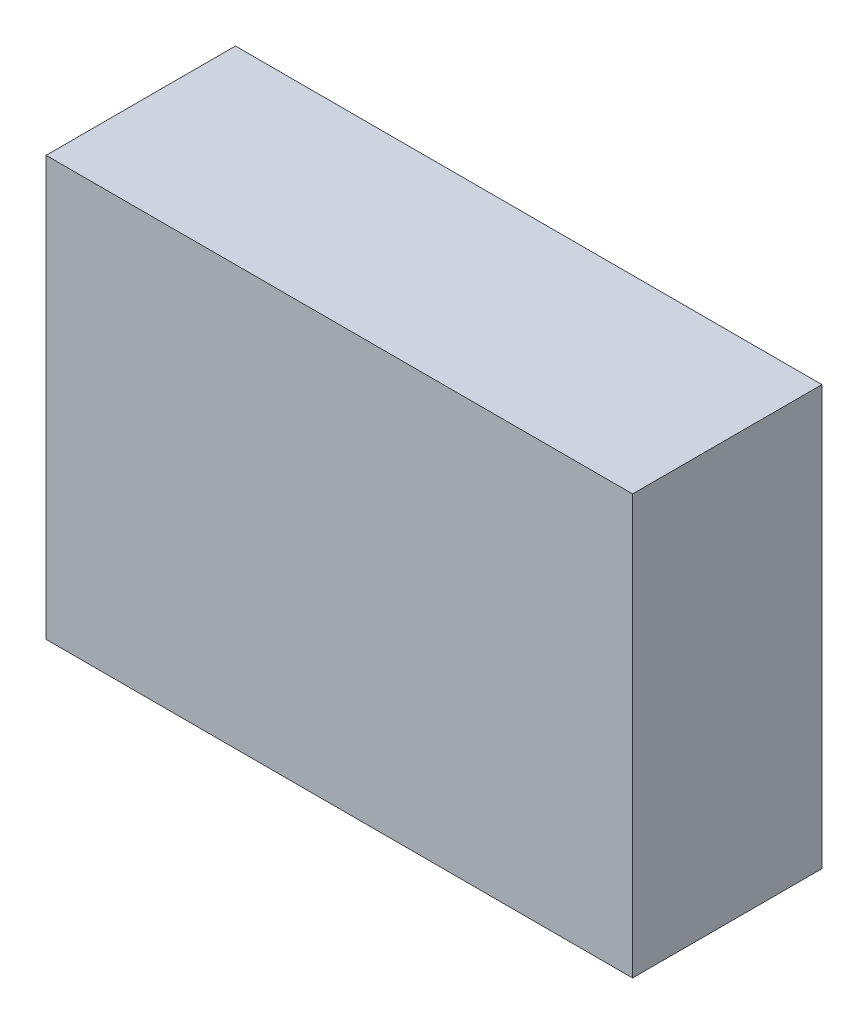
ISO-10303-21;
HEADER;
FILE_DESCRIPTION(('STEP AP214'),'2;1');
FILE_NAME('part.step','',(''),(''),'','','');
FILE_SCHEMA(('AUTOMOTIVE_DESIGN { 1 0 10303 214 1 1 1 1 }'));
ENDSEC;
DATA;
#1=APPLICATION_CONTEXT('core data for automotive mechanical design processes');
#2=APPLICATION_PROTOCOL_DEFINITION('international standard','automotive_design',2000,#1);
#3=PRODUCT_CONTEXT('',#1,'mechanical');
#4=PRODUCT('Part','Part','',(#3));
#5=PRODUCT_RELATED_PRODUCT_CATEGORY('part','',(#4));
#6=PRODUCT_DEFINITION_FORMATION('','',#4);
#7=PRODUCT_DEFINITION_CONTEXT('part definition',#1,'design');
#8=PRODUCT_DEFINITION('design','',#6,#7);
#9=PRODUCT_DEFINITION_SHAPE('','',#8);
#10=(LENGTH_UNIT() NAMED_UNIT(*) SI_UNIT(.MILLI.,.METRE.));
#11=(NAMED_UNIT(*) PLANE_ANGLE_UNIT() SI_UNIT($,.RADIAN.));
#12=(NAMED_UNIT(*) SI_UNIT($,.STERADIAN.) SOLID_ANGLE_UNIT());
#13=UNCERTAINTY_MEASURE_WITH_UNIT(LENGTH_MEASURE(1.E-05),#10,'distance_accuracy_value','');
#14=(GEOMETRIC_REPRESENTATION_CONTEXT(3) GLOBAL_UNCERTAINTY_ASSIGNED_CONTEXT((#13)) GLOBAL_UNIT_ASSIGNED_CONTEXT((#10,
#11,#12)) REPRESENTATION_CONTEXT('',''));
#15=CARTESIAN_POINT('',(0.,0.,0.));
#16=DIRECTION('',(0.,0.,1.));
#17=DIRECTION('',(1.,0.,0.));
#18=AXIS2_PLACEMENT_3D('',#15,#16,#17);
#19=CARTESIAN_POINT('',(0.,0.,0.686));
#20=DIRECTION('',(0.,0.,1.));
#21=DIRECTION('',(1.,0.,0.));
#22=AXIS2_PLACEMENT_3D('',#19,#20,#21);
#23=PLANE('',#22);
#24=DIRECTION('',(0.,1.,0.));
#25=VECTOR('',#24,1.);
#26=CARTESIAN_POINT('',(0.,0.,0.686));
#27=LINE('',#26,#25);
#28=CARTESIAN_POINT('',(0.,0.,0.686));
#29=VERTEX_POINT('',#28);
#30=CARTESIAN_POINT('',(0.,1.519,0.686));
#31=VERTEX_POINT('',#30);
#32=EDGE_CURVE('E81',#29,#31,#27,.T.);
#33=ORIENTED_EDGE('',*,*,#32,.F.);
#34=DIRECTION('',(1.,0.,0.));
#35=VECTOR('',#34,1.);
#36=CARTESIAN_POINT('',(0.,0.,0.686));
#37=LINE('',#36,#35);
#38=CARTESIAN_POINT('',(2.125,0.,0.686));
#39=VERTEX_POINT('',#38);
#40=EDGE_CURVE('E65',#29,#39,#37,.T.);
#41=ORIENTED_EDGE('',*,*,#40,.T.);
#42=DIRECTION('',(0.,1.,0.));
#43=VECTOR('',#42,1.);
#44=CARTESIAN_POINT('',(2.125,0.,0.686));
#45=LINE('',#44,#43);
#46=CARTESIAN_POINT('',(2.125,1.519,0.686));
#47=VERTEX_POINT('',#46);
#48=EDGE_CURVE('E75',#39,#47,#45,.T.);
#49=ORIENTED_EDGE('',*,*,#48,.T.);
#50=DIRECTION('',(1.,0.,0.));
#51=VECTOR('',#50,1.);
#52=CARTESIAN_POINT('',(0.,1.519,0.686));
#53=LINE('',#52,#51);
#54=EDGE_CURVE('E10',#31,#47,#53,.T.);
#55=ORIENTED_EDGE('',*,*,#54,.F.);
#56=EDGE_LOOP('',(#33,#41,#49,#55));
#57=FACE_BOUND('',#56,.T.);
#58=ADVANCED_FACE('F15',(#57),#23,.T.);
#59=CARTESIAN_POINT('',(0.,0.,0.));
#60=DIRECTION('',(0.,0.,1.));
#61=DIRECTION('',(1.,0.,0.));
#62=AXIS2_PLACEMENT_3D('',#59,#60,#61);
#63=PLANE('',#62);
#64=DIRECTION('',(1.,0.,0.));
#65=VECTOR('',#64,1.);
#66=CARTESIAN_POINT('',(0.,1.519,0.));
#67=LINE('',#66,#65);
#68=CARTESIAN_POINT('',(0.,1.519,0.));
#69=VERTEX_POINT('',#68);
#70=CARTESIAN_POINT('',(2.125,1.519,0.));
#71=VERTEX_POINT('',#70);
#72=EDGE_CURVE('E26',#69,#71,#67,.T.);
#73=ORIENTED_EDGE('',*,*,#72,.T.);
#74=DIRECTION('',(0.,1.,0.));
#75=VECTOR('',#74,1.);
#76=CARTESIAN_POINT('',(2.125,0.,0.));
#77=LINE('',#76,#75);
#78=CARTESIAN_POINT('',(2.125,0.,0.));
#79=VERTEX_POINT('',#78);
#80=EDGE_CURVE('E97',#79,#71,#77,.T.);
#81=ORIENTED_EDGE('',*,*,#80,.F.);
#82=DIRECTION('',(1.,0.,0.));
#83=VECTOR('',#82,1.);
#84=CARTESIAN_POINT('',(0.,0.,0.));
#85=LINE('',#84,#83);
#86=CARTESIAN_POINT('',(0.,0.,0.));
#87=VERTEX_POINT('',#86);
#88=EDGE_CURVE('E19',#87,#79,#85,.T.);
#89=ORIENTED_EDGE('',*,*,#88,.F.);
#90=DIRECTION('',(0.,1.,0.));
#91=VECTOR('',#90,1.);
#92=CARTESIAN_POINT('',(0.,0.,0.));
#93=LINE('',#92,#91);
#94=EDGE_CURVE('E83',#87,#69,#93,.T.);
#95=ORIENTED_EDGE('',*,*,#94,.T.);
#96=EDGE_LOOP('',(#73,#81,#89,#95));
#97=FACE_BOUND('',#96,.T.);
#98=ADVANCED_FACE('F117',(#97),#63,.F.);
#99=CARTESIAN_POINT('',(0.,1.519,0.));
#100=DIRECTION('',(0.,1.,0.));
#101=DIRECTION('',(1.,0.,0.));
#102=AXIS2_PLACEMENT_3D('',#99,#100,#101);
#103=PLANE('',#102);
#104=ORIENTED_EDGE('',*,*,#72,.F.);
#105=DIRECTION('',(0.,0.,1.));
#106=VECTOR('',#105,1.);
#107=CARTESIAN_POINT('',(0.,1.519,0.));
#108=LINE('',#107,#106);
#109=EDGE_CURVE('E87',#69,#31,#108,.T.);
#110=ORIENTED_EDGE('',*,*,#109,.T.);
#111=ORIENTED_EDGE('',*,*,#54,.T.);
#112=DIRECTION('',(0.,0.,1.));
#113=VECTOR('',#112,1.);
#114=CARTESIAN_POINT('',(2.125,1.519,0.));
#115=LINE('',#114,#113);
#116=EDGE_CURVE('E105',#71,#47,#115,.T.);
#117=ORIENTED_EDGE('',*,*,#116,.F.);
#118=EDGE_LOOP('',(#104,#110,#111,#117));
#119=FACE_BOUND('',#118,.T.);
#120=ADVANCED_FACE('F114',(#119),#103,.T.);
#121=CARTESIAN_POINT('',(0.,0.,0.));
#122=DIRECTION('',(0.,1.,0.));
#123=DIRECTION('',(1.,0.,0.));
#124=AXIS2_PLACEMENT_3D('',#121,#122,#123);
#125=PLANE('',#124);
#126=DIRECTION('',(0.,0.,1.));
#127=VECTOR('',#126,1.);
#128=CARTESIAN_POINT('',(2.125,0.,0.));
#129=LINE('',#128,#127);
#130=EDGE_CURVE('E70',#79,#39,#129,.T.);
#131=ORIENTED_EDGE('',*,*,#130,.T.);
#132=ORIENTED_EDGE('',*,*,#40,.F.);
#133=DIRECTION('',(0.,0.,1.));
#134=VECTOR('',#133,1.);
#135=CARTESIAN_POINT('',(0.,0.,0.));
#136=LINE('',#135,#134);
#137=EDGE_CURVE('E67',#87,#29,#136,.T.);
#138=ORIENTED_EDGE('',*,*,#137,.F.);
#139=ORIENTED_EDGE('',*,*,#88,.T.);
#140=EDGE_LOOP('',(#131,#132,#138,#139));
#141=FACE_BOUND('',#140,.T.);
#142=ADVANCED_FACE('F17',(#141),#125,.F.);
#143=CARTESIAN_POINT('',(2.125,0.,0.));
#144=DIRECTION('',(1.,0.,0.));
#145=DIRECTION('',(0.,1.,0.));
#146=AXIS2_PLACEMENT_3D('',#143,#144,#145);
#147=PLANE('',#146);
#148=ORIENTED_EDGE('',*,*,#130,.F.);
#149=ORIENTED_EDGE('',*,*,#80,.T.);
#150=ORIENTED_EDGE('',*,*,#116,.T.);
#151=ORIENTED_EDGE('',*,*,#48,.F.);
#152=EDGE_LOOP('',(#148,#149,#150,#151));
#153=FACE_BOUND('',#152,.T.);
#154=ADVANCED_FACE('F112',(#153),#147,.T.);
#155=CARTESIAN_POINT('',(0.,0.,0.));
#156=DIRECTION('',(1.,0.,0.));
#157=DIRECTION('',(0.,1.,0.));
#158=AXIS2_PLACEMENT_3D('',#155,#156,#157);
#159=PLANE('',#158);
#160=ORIENTED_EDGE('',*,*,#32,.T.);
#161=ORIENTED_EDGE('',*,*,#109,.F.);
#162=ORIENTED_EDGE('',*,*,#94,.F.);
#163=ORIENTED_EDGE('',*,*,#137,.T.);
#164=EDGE_LOOP('',(#160,#161,#162,#163));
#165=FACE_BOUND('',#164,.T.);
#166=ADVANCED_FACE('F79',(#165),#159,.F.);
#167=CLOSED_SHELL('',(#58,#98,#120,#142,#154,#166));
#168=MANIFOLD_SOLID_BREP('B1',#167);
#169=ADVANCED_BREP_SHAPE_REPRESENTATION('',(#18,#168),#14);
#170=SHAPE_DEFINITION_REPRESENTATION(#9,#169);
ENDSEC;
END-ISO-10303-21;
